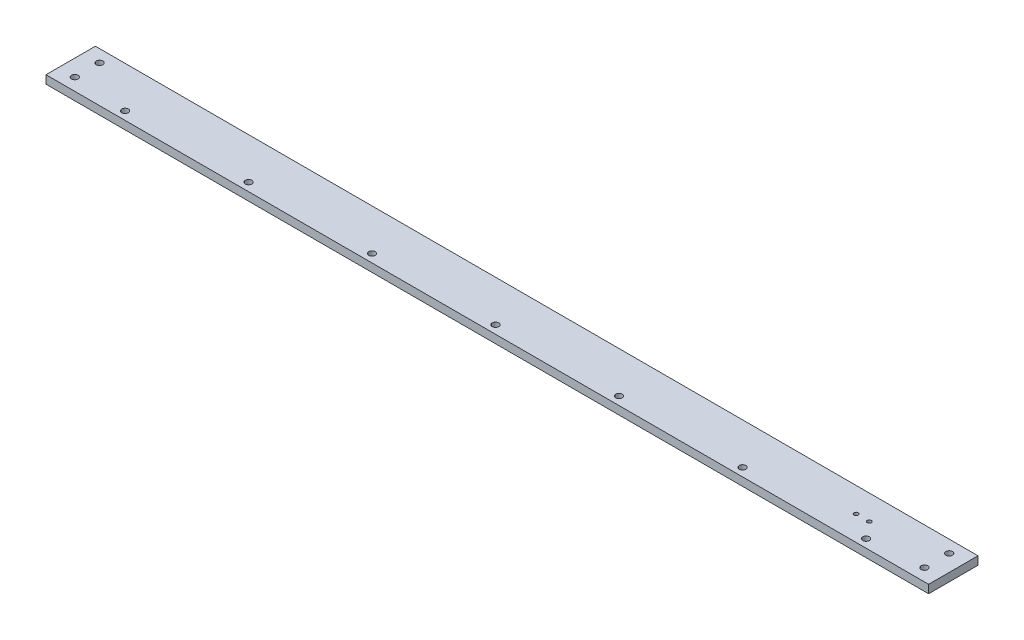
ISO-10303-21;
HEADER;
FILE_DESCRIPTION(('STEP AP214'),'2;1');
FILE_NAME('part.step','',(''),(''),'','','');
FILE_SCHEMA(('AUTOMOTIVE_DESIGN { 1 0 10303 214 1 1 1 1 }'));
ENDSEC;
DATA;
#1=APPLICATION_CONTEXT('core data for automotive mechanical design processes');
#2=APPLICATION_PROTOCOL_DEFINITION('international standard','automotive_design',2000,#1);
#3=PRODUCT_CONTEXT('',#1,'mechanical');
#4=PRODUCT('Part','Part','',(#3));
#5=PRODUCT_RELATED_PRODUCT_CATEGORY('part','',(#4));
#6=PRODUCT_DEFINITION_FORMATION('','',#4);
#7=PRODUCT_DEFINITION_CONTEXT('part definition',#1,'design');
#8=PRODUCT_DEFINITION('design','',#6,#7);
#9=PRODUCT_DEFINITION_SHAPE('','',#8);
#10=(LENGTH_UNIT() NAMED_UNIT(*) SI_UNIT(.MILLI.,.METRE.));
#11=(NAMED_UNIT(*) PLANE_ANGLE_UNIT() SI_UNIT($,.RADIAN.));
#12=(NAMED_UNIT(*) SI_UNIT($,.STERADIAN.) SOLID_ANGLE_UNIT());
#13=UNCERTAINTY_MEASURE_WITH_UNIT(LENGTH_MEASURE(1.E-05),#10,'distance_accuracy_value','');
#14=(GEOMETRIC_REPRESENTATION_CONTEXT(3) GLOBAL_UNCERTAINTY_ASSIGNED_CONTEXT((#13)) GLOBAL_UNIT_ASSIGNED_CONTEXT((#10,
#11,#12)) REPRESENTATION_CONTEXT('',''));
#15=CARTESIAN_POINT('',(0.,0.,0.));
#16=DIRECTION('',(0.,0.,1.));
#17=DIRECTION('',(1.,0.,0.));
#18=AXIS2_PLACEMENT_3D('',#15,#16,#17);
#19=CARTESIAN_POINT('',(-268.,5.,15.));
#20=DIRECTION('',(1.,0.,0.));
#21=DIRECTION('',(0.,0.,-1.));
#22=AXIS2_PLACEMENT_3D('',#19,#20,#21);
#23=PLANE('',#22);
#24=DIRECTION('',(0.,0.,1.));
#25=VECTOR('',#24,1.);
#26=CARTESIAN_POINT('',(-268.,0.,15.));
#27=LINE('',#26,#25);
#28=CARTESIAN_POINT('',(-268.,0.,-15.));
#29=VERTEX_POINT('',#28);
#30=CARTESIAN_POINT('',(-268.,0.,15.));
#31=VERTEX_POINT('',#30);
#32=EDGE_CURVE('E99',#29,#31,#27,.T.);
#33=ORIENTED_EDGE('',*,*,#32,.T.);
#34=DIRECTION('',(0.,-1.,0.));
#35=VECTOR('',#34,1.);
#36=CARTESIAN_POINT('',(-268.,5.,15.));
#37=LINE('',#36,#35);
#38=CARTESIAN_POINT('',(-268.,5.,15.));
#39=VERTEX_POINT('',#38);
#40=EDGE_CURVE('E11',#39,#31,#37,.T.);
#41=ORIENTED_EDGE('',*,*,#40,.F.);
#42=DIRECTION('',(0.,0.,1.));
#43=VECTOR('',#42,1.);
#44=CARTESIAN_POINT('',(-268.,5.,15.));
#45=LINE('',#44,#43);
#46=CARTESIAN_POINT('',(-268.,5.,-15.));
#47=VERTEX_POINT('',#46);
#48=EDGE_CURVE('E86',#47,#39,#45,.T.);
#49=ORIENTED_EDGE('',*,*,#48,.F.);
#50=DIRECTION('',(0.,-1.,0.));
#51=VECTOR('',#50,1.);
#52=CARTESIAN_POINT('',(-268.,5.,-15.));
#53=LINE('',#52,#51);
#54=EDGE_CURVE('E95',#47,#29,#53,.T.);
#55=ORIENTED_EDGE('',*,*,#54,.T.);
#56=EDGE_LOOP('',(#33,#41,#49,#55));
#57=FACE_BOUND('',#56,.T.);
#58=ADVANCED_FACE('F33',(#57),#23,.F.);
#59=CARTESIAN_POINT('',(268.,5.,15.));
#60=DIRECTION('',(0.,0.,-1.));
#61=DIRECTION('',(-1.,0.,0.));
#62=AXIS2_PLACEMENT_3D('',#59,#60,#61);
#63=PLANE('',#62);
#64=DIRECTION('',(1.,0.,0.));
#65=VECTOR('',#64,1.);
#66=CARTESIAN_POINT('',(268.,0.,15.));
#67=LINE('',#66,#65);
#68=CARTESIAN_POINT('',(268.,0.,15.));
#69=VERTEX_POINT('',#68);
#70=EDGE_CURVE('E90',#31,#69,#67,.T.);
#71=ORIENTED_EDGE('',*,*,#70,.T.);
#72=DIRECTION('',(0.,-1.,0.));
#73=VECTOR('',#72,1.);
#74=CARTESIAN_POINT('',(268.,5.,15.));
#75=LINE('',#74,#73);
#76=CARTESIAN_POINT('',(268.,5.,15.));
#77=VERTEX_POINT('',#76);
#78=EDGE_CURVE('E42',#77,#69,#75,.T.);
#79=ORIENTED_EDGE('',*,*,#78,.F.);
#80=DIRECTION('',(1.,0.,0.));
#81=VECTOR('',#80,1.);
#82=CARTESIAN_POINT('',(268.,5.,15.));
#83=LINE('',#82,#81);
#84=EDGE_CURVE('E81',#39,#77,#83,.T.);
#85=ORIENTED_EDGE('',*,*,#84,.F.);
#86=ORIENTED_EDGE('',*,*,#40,.T.);
#87=EDGE_LOOP('',(#71,#79,#85,#86));
#88=FACE_BOUND('',#87,.T.);
#89=ADVANCED_FACE('F89',(#88),#63,.F.);
#90=CARTESIAN_POINT('',(268.,5.,15.));
#91=DIRECTION('',(-1.,0.,0.));
#92=DIRECTION('',(0.,0.,1.));
#93=AXIS2_PLACEMENT_3D('',#90,#91,#92);
#94=PLANE('',#93);
#95=DIRECTION('',(0.,0.,-1.));
#96=VECTOR('',#95,1.);
#97=CARTESIAN_POINT('',(268.,0.,15.));
#98=LINE('',#97,#96);
#99=CARTESIAN_POINT('',(268.,0.,-15.));
#100=VERTEX_POINT('',#99);
#101=EDGE_CURVE('E68',#69,#100,#98,.T.);
#102=ORIENTED_EDGE('',*,*,#101,.T.);
#103=DIRECTION('',(0.,-1.,0.));
#104=VECTOR('',#103,1.);
#105=CARTESIAN_POINT('',(268.,5.,-15.));
#106=LINE('',#105,#104);
#107=CARTESIAN_POINT('',(268.,5.,-15.));
#108=VERTEX_POINT('',#107);
#109=EDGE_CURVE('E91',#108,#100,#106,.T.);
#110=ORIENTED_EDGE('',*,*,#109,.F.);
#111=DIRECTION('',(0.,0.,-1.));
#112=VECTOR('',#111,1.);
#113=CARTESIAN_POINT('',(268.,5.,15.));
#114=LINE('',#113,#112);
#115=EDGE_CURVE('E84',#77,#108,#114,.T.);
#116=ORIENTED_EDGE('',*,*,#115,.F.);
#117=ORIENTED_EDGE('',*,*,#78,.T.);
#118=EDGE_LOOP('',(#102,#110,#116,#117));
#119=FACE_BOUND('',#118,.T.);
#120=ADVANCED_FACE('F93',(#119),#94,.F.);
#121=CARTESIAN_POINT('',(268.,5.,-15.));
#122=DIRECTION('',(0.,0.,1.));
#123=DIRECTION('',(1.,0.,0.));
#124=AXIS2_PLACEMENT_3D('',#121,#122,#123);
#125=PLANE('',#124);
#126=DIRECTION('',(-1.,0.,0.));
#127=VECTOR('',#126,1.);
#128=CARTESIAN_POINT('',(268.,0.,-15.));
#129=LINE('',#128,#127);
#130=EDGE_CURVE('E74',#100,#29,#129,.T.);
#131=ORIENTED_EDGE('',*,*,#130,.T.);
#132=ORIENTED_EDGE('',*,*,#54,.F.);
#133=DIRECTION('',(-1.,0.,0.));
#134=VECTOR('',#133,1.);
#135=CARTESIAN_POINT('',(268.,5.,-15.));
#136=LINE('',#135,#134);
#137=EDGE_CURVE('E51',#108,#47,#136,.T.);
#138=ORIENTED_EDGE('',*,*,#137,.F.);
#139=ORIENTED_EDGE('',*,*,#109,.T.);
#140=EDGE_LOOP('',(#131,#132,#138,#139));
#141=FACE_BOUND('',#140,.T.);
#142=ADVANCED_FACE('F197',(#141),#125,.F.);
#143=CARTESIAN_POINT('',(0.,5.,0.));
#144=DIRECTION('',(0.,1.,0.));
#145=DIRECTION('',(0.,0.,1.));
#146=AXIS2_PLACEMENT_3D('',#143,#144,#145);
#147=PLANE('',#146);
#148=CARTESIAN_POINT('',(216.980485857023,5.,0.));
#149=DIRECTION('',(0.,1.,0.));
#150=DIRECTION('',(0.,0.,1.));
#151=AXIS2_PLACEMENT_3D('',#148,#149,#150);
#152=CIRCLE('',#151,1.25);
#153=CARTESIAN_POINT('',(216.980485857023,5.,1.24999999999998));
#154=VERTEX_POINT('',#153);
#155=EDGE_CURVE('E36',#154,#154,#152,.T.);
#156=ORIENTED_EDGE('',*,*,#155,.F.);
#157=EDGE_LOOP('',(#156));
#158=FACE_BOUND('',#157,.T.);
#159=CARTESIAN_POINT('',(208.980485857023,5.,0.));
#160=DIRECTION('',(0.,1.,0.));
#161=DIRECTION('',(0.,0.,1.));
#162=AXIS2_PLACEMENT_3D('',#159,#160,#161);
#163=CIRCLE('',#162,1.25);
#164=CARTESIAN_POINT('',(208.980485857023,5.,1.24999999999998));
#165=VERTEX_POINT('',#164);
#166=EDGE_CURVE('E107',#165,#165,#163,.T.);
#167=ORIENTED_EDGE('',*,*,#166,.F.);
#168=EDGE_LOOP('',(#167));
#169=FACE_BOUND('',#168,.T.);
#170=CARTESIAN_POINT('',(-258.,5.,-7.49999999999996));
#171=DIRECTION('',(0.,1.,0.));
#172=DIRECTION('',(0.,0.,1.));
#173=AXIS2_PLACEMENT_3D('',#170,#171,#172);
#174=CIRCLE('',#173,2.);
#175=CARTESIAN_POINT('',(-258.,5.,-5.49999999999996));
#176=VERTEX_POINT('',#175);
#177=EDGE_CURVE('E109',#176,#176,#174,.T.);
#178=ORIENTED_EDGE('',*,*,#177,.F.);
#179=EDGE_LOOP('',(#178));
#180=FACE_BOUND('',#179,.T.);
#181=CARTESIAN_POINT('',(-258.,5.,7.50000000000004));
#182=DIRECTION('',(0.,1.,0.));
#183=DIRECTION('',(0.,0.,1.));
#184=AXIS2_PLACEMENT_3D('',#181,#182,#183);
#185=CIRCLE('',#184,2.);
#186=CARTESIAN_POINT('',(-258.,5.,9.50000000000004));
#187=VERTEX_POINT('',#186);
#188=EDGE_CURVE('E126',#187,#187,#185,.T.);
#189=ORIENTED_EDGE('',*,*,#188,.F.);
#190=EDGE_LOOP('',(#189));
#191=FACE_BOUND('',#190,.T.);
#192=CARTESIAN_POINT('',(-225.,5.,10.0000000000001));
#193=DIRECTION('',(0.,1.,0.));
#194=DIRECTION('',(0.,0.,1.));
#195=AXIS2_PLACEMENT_3D('',#192,#193,#194);
#196=CIRCLE('',#195,2.);
#197=CARTESIAN_POINT('',(-225.,5.,12.0000000000001));
#198=VERTEX_POINT('',#197);
#199=EDGE_CURVE('E132',#198,#198,#196,.T.);
#200=ORIENTED_EDGE('',*,*,#199,.F.);
#201=EDGE_LOOP('',(#200));
#202=FACE_BOUND('',#201,.T.);
#203=CARTESIAN_POINT('',(-150.,5.,10.0000000000001));
#204=DIRECTION('',(0.,1.,0.));
#205=DIRECTION('',(0.,0.,1.));
#206=AXIS2_PLACEMENT_3D('',#203,#204,#205);
#207=CIRCLE('',#206,2.);
#208=CARTESIAN_POINT('',(-150.,5.,12.0000000000001));
#209=VERTEX_POINT('',#208);
#210=EDGE_CURVE('E138',#209,#209,#207,.T.);
#211=ORIENTED_EDGE('',*,*,#210,.F.);
#212=EDGE_LOOP('',(#211));
#213=FACE_BOUND('',#212,.T.);
#214=CARTESIAN_POINT('',(-75.,5.,10.0000000000001));
#215=DIRECTION('',(0.,1.,0.));
#216=DIRECTION('',(0.,0.,1.));
#217=AXIS2_PLACEMENT_3D('',#214,#215,#216);
#218=CIRCLE('',#217,2.);
#219=CARTESIAN_POINT('',(-75.,5.,12.0000000000001));
#220=VERTEX_POINT('',#219);
#221=EDGE_CURVE('E144',#220,#220,#218,.T.);
#222=ORIENTED_EDGE('',*,*,#221,.F.);
#223=EDGE_LOOP('',(#222));
#224=FACE_BOUND('',#223,.T.);
#225=CARTESIAN_POINT('',(0.,5.,10.));
#226=DIRECTION('',(0.,1.,0.));
#227=DIRECTION('',(0.,0.,1.));
#228=AXIS2_PLACEMENT_3D('',#225,#226,#227);
#229=CIRCLE('',#228,2.);
#230=CARTESIAN_POINT('',(0.,5.,12.));
#231=VERTEX_POINT('',#230);
#232=EDGE_CURVE('E150',#231,#231,#229,.T.);
#233=ORIENTED_EDGE('',*,*,#232,.F.);
#234=EDGE_LOOP('',(#233));
#235=FACE_BOUND('',#234,.T.);
#236=CARTESIAN_POINT('',(75.,5.,10.));
#237=DIRECTION('',(0.,1.,0.));
#238=DIRECTION('',(0.,0.,1.));
#239=AXIS2_PLACEMENT_3D('',#236,#237,#238);
#240=CIRCLE('',#239,2.);
#241=CARTESIAN_POINT('',(75.,5.,12.));
#242=VERTEX_POINT('',#241);
#243=EDGE_CURVE('E156',#242,#242,#240,.T.);
#244=ORIENTED_EDGE('',*,*,#243,.F.);
#245=EDGE_LOOP('',(#244));
#246=FACE_BOUND('',#245,.T.);
#247=CARTESIAN_POINT('',(150.,5.,10.));
#248=DIRECTION('',(0.,1.,0.));
#249=DIRECTION('',(0.,0.,1.));
#250=AXIS2_PLACEMENT_3D('',#247,#248,#249);
#251=CIRCLE('',#250,2.);
#252=CARTESIAN_POINT('',(150.,5.,12.));
#253=VERTEX_POINT('',#252);
#254=EDGE_CURVE('E162',#253,#253,#251,.T.);
#255=ORIENTED_EDGE('',*,*,#254,.F.);
#256=EDGE_LOOP('',(#255));
#257=FACE_BOUND('',#256,.T.);
#258=CARTESIAN_POINT('',(225.,5.,10.));
#259=DIRECTION('',(0.,1.,0.));
#260=DIRECTION('',(0.,0.,1.));
#261=AXIS2_PLACEMENT_3D('',#258,#259,#260);
#262=CIRCLE('',#261,2.);
#263=CARTESIAN_POINT('',(225.,5.,12.));
#264=VERTEX_POINT('',#263);
#265=EDGE_CURVE('E168',#264,#264,#262,.T.);
#266=ORIENTED_EDGE('',*,*,#265,.F.);
#267=EDGE_LOOP('',(#266));
#268=FACE_BOUND('',#267,.T.);
#269=CARTESIAN_POINT('',(258.,5.,7.50000000000004));
#270=DIRECTION('',(0.,1.,0.));
#271=DIRECTION('',(0.,0.,1.));
#272=AXIS2_PLACEMENT_3D('',#269,#270,#271);
#273=CIRCLE('',#272,2.);
#274=CARTESIAN_POINT('',(258.,5.,9.50000000000004));
#275=VERTEX_POINT('',#274);
#276=EDGE_CURVE('E174',#275,#275,#273,.T.);
#277=ORIENTED_EDGE('',*,*,#276,.F.);
#278=EDGE_LOOP('',(#277));
#279=FACE_BOUND('',#278,.T.);
#280=CARTESIAN_POINT('',(258.,5.,-7.49999999999996));
#281=DIRECTION('',(0.,1.,0.));
#282=DIRECTION('',(0.,0.,1.));
#283=AXIS2_PLACEMENT_3D('',#280,#281,#282);
#284=CIRCLE('',#283,2.);
#285=CARTESIAN_POINT('',(258.,5.,-5.49999999999996));
#286=VERTEX_POINT('',#285);
#287=EDGE_CURVE('E180',#286,#286,#284,.T.);
#288=ORIENTED_EDGE('',*,*,#287,.F.);
#289=EDGE_LOOP('',(#288));
#290=FACE_BOUND('',#289,.T.);
#291=ORIENTED_EDGE('',*,*,#48,.T.);
#292=ORIENTED_EDGE('',*,*,#84,.T.);
#293=ORIENTED_EDGE('',*,*,#115,.T.);
#294=ORIENTED_EDGE('',*,*,#137,.T.);
#295=EDGE_LOOP('',(#291,#292,#293,#294));
#296=FACE_BOUND('',#295,.T.);
#297=ADVANCED_FACE('F82',(#158,#169,#180,#191,#202,#213,#224,#235,#246,#257,#268,#279,#290,
#296),#147,.T.);
#298=CARTESIAN_POINT('',(0.,0.,0.));
#299=DIRECTION('',(0.,1.,0.));
#300=DIRECTION('',(0.,0.,1.));
#301=AXIS2_PLACEMENT_3D('',#298,#299,#300);
#302=PLANE('',#301);
#303=CARTESIAN_POINT('',(216.980485857023,0.,0.));
#304=DIRECTION('',(0.,-1.,0.));
#305=DIRECTION('',(0.,0.,-1.));
#306=AXIS2_PLACEMENT_3D('',#303,#304,#305);
#307=CIRCLE('',#306,1.25);
#308=CARTESIAN_POINT('',(216.980485857023,0.,-1.25000000000003));
#309=VERTEX_POINT('',#308);
#310=EDGE_CURVE('E121',#309,#309,#307,.T.);
#311=ORIENTED_EDGE('',*,*,#310,.F.);
#312=EDGE_LOOP('',(#311));
#313=FACE_BOUND('',#312,.T.);
#314=CARTESIAN_POINT('',(208.980485857023,0.,0.));
#315=DIRECTION('',(0.,-1.,0.));
#316=DIRECTION('',(0.,0.,-1.));
#317=AXIS2_PLACEMENT_3D('',#314,#315,#316);
#318=CIRCLE('',#317,1.25);
#319=CARTESIAN_POINT('',(208.980485857023,0.,-1.25000000000003));
#320=VERTEX_POINT('',#319);
#321=EDGE_CURVE('E110',#320,#320,#318,.T.);
#322=ORIENTED_EDGE('',*,*,#321,.F.);
#323=EDGE_LOOP('',(#322));
#324=FACE_BOUND('',#323,.T.);
#325=CARTESIAN_POINT('',(-258.,0.,-7.49999999999996));
#326=DIRECTION('',(0.,1.,0.));
#327=DIRECTION('',(0.,0.,1.));
#328=AXIS2_PLACEMENT_3D('',#325,#326,#327);
#329=CIRCLE('',#328,2.);
#330=CARTESIAN_POINT('',(-258.,0.,-5.49999999999996));
#331=VERTEX_POINT('',#330);
#332=EDGE_CURVE('E114',#331,#331,#329,.T.);
#333=ORIENTED_EDGE('',*,*,#332,.T.);
#334=EDGE_LOOP('',(#333));
#335=FACE_BOUND('',#334,.T.);
#336=CARTESIAN_POINT('',(-258.,0.,7.50000000000004));
#337=DIRECTION('',(0.,1.,0.));
#338=DIRECTION('',(0.,0.,1.));
#339=AXIS2_PLACEMENT_3D('',#336,#337,#338);
#340=CIRCLE('',#339,2.);
#341=CARTESIAN_POINT('',(-258.,0.,9.50000000000004));
#342=VERTEX_POINT('',#341);
#343=EDGE_CURVE('E129',#342,#342,#340,.T.);
#344=ORIENTED_EDGE('',*,*,#343,.T.);
#345=EDGE_LOOP('',(#344));
#346=FACE_BOUND('',#345,.T.);
#347=CARTESIAN_POINT('',(-225.,0.,10.0000000000001));
#348=DIRECTION('',(0.,1.,0.));
#349=DIRECTION('',(0.,0.,1.));
#350=AXIS2_PLACEMENT_3D('',#347,#348,#349);
#351=CIRCLE('',#350,2.);
#352=CARTESIAN_POINT('',(-225.,0.,12.0000000000001));
#353=VERTEX_POINT('',#352);
#354=EDGE_CURVE('E135',#353,#353,#351,.T.);
#355=ORIENTED_EDGE('',*,*,#354,.T.);
#356=EDGE_LOOP('',(#355));
#357=FACE_BOUND('',#356,.T.);
#358=CARTESIAN_POINT('',(-150.,0.,10.0000000000001));
#359=DIRECTION('',(0.,1.,0.));
#360=DIRECTION('',(0.,0.,1.));
#361=AXIS2_PLACEMENT_3D('',#358,#359,#360);
#362=CIRCLE('',#361,2.);
#363=CARTESIAN_POINT('',(-150.,0.,12.0000000000001));
#364=VERTEX_POINT('',#363);
#365=EDGE_CURVE('E141',#364,#364,#362,.T.);
#366=ORIENTED_EDGE('',*,*,#365,.T.);
#367=EDGE_LOOP('',(#366));
#368=FACE_BOUND('',#367,.T.);
#369=CARTESIAN_POINT('',(-75.,0.,10.0000000000001));
#370=DIRECTION('',(0.,1.,0.));
#371=DIRECTION('',(0.,0.,1.));
#372=AXIS2_PLACEMENT_3D('',#369,#370,#371);
#373=CIRCLE('',#372,2.);
#374=CARTESIAN_POINT('',(-75.,0.,12.0000000000001));
#375=VERTEX_POINT('',#374);
#376=EDGE_CURVE('E147',#375,#375,#373,.T.);
#377=ORIENTED_EDGE('',*,*,#376,.T.);
#378=EDGE_LOOP('',(#377));
#379=FACE_BOUND('',#378,.T.);
#380=CARTESIAN_POINT('',(0.,0.,10.));
#381=DIRECTION('',(0.,1.,0.));
#382=DIRECTION('',(0.,0.,1.));
#383=AXIS2_PLACEMENT_3D('',#380,#381,#382);
#384=CIRCLE('',#383,2.);
#385=CARTESIAN_POINT('',(0.,0.,12.));
#386=VERTEX_POINT('',#385);
#387=EDGE_CURVE('E153',#386,#386,#384,.T.);
#388=ORIENTED_EDGE('',*,*,#387,.T.);
#389=EDGE_LOOP('',(#388));
#390=FACE_BOUND('',#389,.T.);
#391=CARTESIAN_POINT('',(75.,0.,10.));
#392=DIRECTION('',(0.,1.,0.));
#393=DIRECTION('',(0.,0.,1.));
#394=AXIS2_PLACEMENT_3D('',#391,#392,#393);
#395=CIRCLE('',#394,2.);
#396=CARTESIAN_POINT('',(75.,0.,12.));
#397=VERTEX_POINT('',#396);
#398=EDGE_CURVE('E159',#397,#397,#395,.T.);
#399=ORIENTED_EDGE('',*,*,#398,.T.);
#400=EDGE_LOOP('',(#399));
#401=FACE_BOUND('',#400,.T.);
#402=CARTESIAN_POINT('',(150.,0.,10.));
#403=DIRECTION('',(0.,1.,0.));
#404=DIRECTION('',(0.,0.,1.));
#405=AXIS2_PLACEMENT_3D('',#402,#403,#404);
#406=CIRCLE('',#405,2.);
#407=CARTESIAN_POINT('',(150.,0.,12.));
#408=VERTEX_POINT('',#407);
#409=EDGE_CURVE('E165',#408,#408,#406,.T.);
#410=ORIENTED_EDGE('',*,*,#409,.T.);
#411=EDGE_LOOP('',(#410));
#412=FACE_BOUND('',#411,.T.);
#413=CARTESIAN_POINT('',(225.,0.,10.));
#414=DIRECTION('',(0.,1.,0.));
#415=DIRECTION('',(0.,0.,1.));
#416=AXIS2_PLACEMENT_3D('',#413,#414,#415);
#417=CIRCLE('',#416,2.);
#418=CARTESIAN_POINT('',(225.,0.,12.));
#419=VERTEX_POINT('',#418);
#420=EDGE_CURVE('E171',#419,#419,#417,.T.);
#421=ORIENTED_EDGE('',*,*,#420,.T.);
#422=EDGE_LOOP('',(#421));
#423=FACE_BOUND('',#422,.T.);
#424=CARTESIAN_POINT('',(258.,0.,7.50000000000004));
#425=DIRECTION('',(0.,1.,0.));
#426=DIRECTION('',(0.,0.,1.));
#427=AXIS2_PLACEMENT_3D('',#424,#425,#426);
#428=CIRCLE('',#427,2.);
#429=CARTESIAN_POINT('',(258.,0.,9.50000000000004));
#430=VERTEX_POINT('',#429);
#431=EDGE_CURVE('E177',#430,#430,#428,.T.);
#432=ORIENTED_EDGE('',*,*,#431,.T.);
#433=EDGE_LOOP('',(#432));
#434=FACE_BOUND('',#433,.T.);
#435=CARTESIAN_POINT('',(258.,0.,-7.49999999999996));
#436=DIRECTION('',(0.,1.,0.));
#437=DIRECTION('',(0.,0.,1.));
#438=AXIS2_PLACEMENT_3D('',#435,#436,#437);
#439=CIRCLE('',#438,2.);
#440=CARTESIAN_POINT('',(258.,0.,-5.49999999999996));
#441=VERTEX_POINT('',#440);
#442=EDGE_CURVE('E102',#441,#441,#439,.T.);
#443=ORIENTED_EDGE('',*,*,#442,.T.);
#444=EDGE_LOOP('',(#443));
#445=FACE_BOUND('',#444,.T.);
#446=ORIENTED_EDGE('',*,*,#32,.F.);
#447=ORIENTED_EDGE('',*,*,#130,.F.);
#448=ORIENTED_EDGE('',*,*,#101,.F.);
#449=ORIENTED_EDGE('',*,*,#70,.F.);
#450=EDGE_LOOP('',(#446,#447,#448,#449));
#451=FACE_BOUND('',#450,.T.);
#452=ADVANCED_FACE('F186',(#313,#324,#335,#346,#357,#368,#379,#390,#401,#412,#423,#434,#445,
#451),#302,.F.);
#453=CARTESIAN_POINT('',(258.,5.,-7.49999999999996));
#454=DIRECTION('',(0.,1.,0.));
#455=DIRECTION('',(0.,0.,1.));
#456=AXIS2_PLACEMENT_3D('',#453,#454,#455);
#457=CYLINDRICAL_SURFACE('',#456,2.);
#458=ORIENTED_EDGE('',*,*,#442,.F.);
#459=EDGE_LOOP('',(#458));
#460=FACE_BOUND('',#459,.T.);
#461=ORIENTED_EDGE('',*,*,#287,.T.);
#462=EDGE_LOOP('',(#461));
#463=FACE_BOUND('',#462,.T.);
#464=ADVANCED_FACE('F189',(#460,#463),#457,.F.);
#465=CARTESIAN_POINT('',(258.,5.,7.50000000000004));
#466=DIRECTION('',(0.,1.,0.));
#467=DIRECTION('',(0.,0.,1.));
#468=AXIS2_PLACEMENT_3D('',#465,#466,#467);
#469=CYLINDRICAL_SURFACE('',#468,2.);
#470=ORIENTED_EDGE('',*,*,#431,.F.);
#471=EDGE_LOOP('',(#470));
#472=FACE_BOUND('',#471,.T.);
#473=ORIENTED_EDGE('',*,*,#276,.T.);
#474=EDGE_LOOP('',(#473));
#475=FACE_BOUND('',#474,.T.);
#476=ADVANCED_FACE('F192',(#472,#475),#469,.F.);
#477=CARTESIAN_POINT('',(225.,5.,10.));
#478=DIRECTION('',(0.,1.,0.));
#479=DIRECTION('',(0.,0.,1.));
#480=AXIS2_PLACEMENT_3D('',#477,#478,#479);
#481=CYLINDRICAL_SURFACE('',#480,2.);
#482=ORIENTED_EDGE('',*,*,#420,.F.);
#483=EDGE_LOOP('',(#482));
#484=FACE_BOUND('',#483,.T.);
#485=ORIENTED_EDGE('',*,*,#265,.T.);
#486=EDGE_LOOP('',(#485));
#487=FACE_BOUND('',#486,.T.);
#488=ADVANCED_FACE('F247',(#484,#487),#481,.F.);
#489=CARTESIAN_POINT('',(150.,5.,10.));
#490=DIRECTION('',(0.,1.,0.));
#491=DIRECTION('',(0.,0.,1.));
#492=AXIS2_PLACEMENT_3D('',#489,#490,#491);
#493=CYLINDRICAL_SURFACE('',#492,2.);
#494=ORIENTED_EDGE('',*,*,#409,.F.);
#495=EDGE_LOOP('',(#494));
#496=FACE_BOUND('',#495,.T.);
#497=ORIENTED_EDGE('',*,*,#254,.T.);
#498=EDGE_LOOP('',(#497));
#499=FACE_BOUND('',#498,.T.);
#500=ADVANCED_FACE('F255',(#496,#499),#493,.F.);
#501=CARTESIAN_POINT('',(75.,5.,10.));
#502=DIRECTION('',(0.,1.,0.));
#503=DIRECTION('',(0.,0.,1.));
#504=AXIS2_PLACEMENT_3D('',#501,#502,#503);
#505=CYLINDRICAL_SURFACE('',#504,2.);
#506=ORIENTED_EDGE('',*,*,#398,.F.);
#507=EDGE_LOOP('',(#506));
#508=FACE_BOUND('',#507,.T.);
#509=ORIENTED_EDGE('',*,*,#243,.T.);
#510=EDGE_LOOP('',(#509));
#511=FACE_BOUND('',#510,.T.);
#512=ADVANCED_FACE('F263',(#508,#511),#505,.F.);
#513=CARTESIAN_POINT('',(0.,5.,10.));
#514=DIRECTION('',(0.,1.,0.));
#515=DIRECTION('',(0.,0.,1.));
#516=AXIS2_PLACEMENT_3D('',#513,#514,#515);
#517=CYLINDRICAL_SURFACE('',#516,2.);
#518=ORIENTED_EDGE('',*,*,#387,.F.);
#519=EDGE_LOOP('',(#518));
#520=FACE_BOUND('',#519,.T.);
#521=ORIENTED_EDGE('',*,*,#232,.T.);
#522=EDGE_LOOP('',(#521));
#523=FACE_BOUND('',#522,.T.);
#524=ADVANCED_FACE('F271',(#520,#523),#517,.F.);
#525=CARTESIAN_POINT('',(-75.,5.,10.0000000000001));
#526=DIRECTION('',(0.,1.,0.));
#527=DIRECTION('',(0.,0.,1.));
#528=AXIS2_PLACEMENT_3D('',#525,#526,#527);
#529=CYLINDRICAL_SURFACE('',#528,2.);
#530=ORIENTED_EDGE('',*,*,#376,.F.);
#531=EDGE_LOOP('',(#530));
#532=FACE_BOUND('',#531,.T.);
#533=ORIENTED_EDGE('',*,*,#221,.T.);
#534=EDGE_LOOP('',(#533));
#535=FACE_BOUND('',#534,.T.);
#536=ADVANCED_FACE('F279',(#532,#535),#529,.F.);
#537=CARTESIAN_POINT('',(-150.,5.,10.0000000000001));
#538=DIRECTION('',(0.,1.,0.));
#539=DIRECTION('',(0.,0.,1.));
#540=AXIS2_PLACEMENT_3D('',#537,#538,#539);
#541=CYLINDRICAL_SURFACE('',#540,2.);
#542=ORIENTED_EDGE('',*,*,#365,.F.);
#543=EDGE_LOOP('',(#542));
#544=FACE_BOUND('',#543,.T.);
#545=ORIENTED_EDGE('',*,*,#210,.T.);
#546=EDGE_LOOP('',(#545));
#547=FACE_BOUND('',#546,.T.);
#548=ADVANCED_FACE('F287',(#544,#547),#541,.F.);
#549=CARTESIAN_POINT('',(-225.,5.,10.0000000000001));
#550=DIRECTION('',(0.,1.,0.));
#551=DIRECTION('',(0.,0.,1.));
#552=AXIS2_PLACEMENT_3D('',#549,#550,#551);
#553=CYLINDRICAL_SURFACE('',#552,2.);
#554=ORIENTED_EDGE('',*,*,#354,.F.);
#555=EDGE_LOOP('',(#554));
#556=FACE_BOUND('',#555,.T.);
#557=ORIENTED_EDGE('',*,*,#199,.T.);
#558=EDGE_LOOP('',(#557));
#559=FACE_BOUND('',#558,.T.);
#560=ADVANCED_FACE('F295',(#556,#559),#553,.F.);
#561=CARTESIAN_POINT('',(-258.,5.,7.50000000000004));
#562=DIRECTION('',(0.,1.,0.));
#563=DIRECTION('',(0.,0.,1.));
#564=AXIS2_PLACEMENT_3D('',#561,#562,#563);
#565=CYLINDRICAL_SURFACE('',#564,2.);
#566=ORIENTED_EDGE('',*,*,#343,.F.);
#567=EDGE_LOOP('',(#566));
#568=FACE_BOUND('',#567,.T.);
#569=ORIENTED_EDGE('',*,*,#188,.T.);
#570=EDGE_LOOP('',(#569));
#571=FACE_BOUND('',#570,.T.);
#572=ADVANCED_FACE('F303',(#568,#571),#565,.F.);
#573=CARTESIAN_POINT('',(-258.,5.,-7.49999999999996));
#574=DIRECTION('',(0.,1.,0.));
#575=DIRECTION('',(0.,0.,1.));
#576=AXIS2_PLACEMENT_3D('',#573,#574,#575);
#577=CYLINDRICAL_SURFACE('',#576,2.);
#578=ORIENTED_EDGE('',*,*,#332,.F.);
#579=EDGE_LOOP('',(#578));
#580=FACE_BOUND('',#579,.T.);
#581=ORIENTED_EDGE('',*,*,#177,.T.);
#582=EDGE_LOOP('',(#581));
#583=FACE_BOUND('',#582,.T.);
#584=ADVANCED_FACE('F311',(#580,#583),#577,.F.);
#585=CARTESIAN_POINT('',(208.980485857023,0.,0.));
#586=DIRECTION('',(0.,-1.,0.));
#587=DIRECTION('',(0.,0.,-1.));
#588=AXIS2_PLACEMENT_3D('',#585,#586,#587);
#589=CYLINDRICAL_SURFACE('',#588,1.25);
#590=ORIENTED_EDGE('',*,*,#166,.T.);
#591=EDGE_LOOP('',(#590));
#592=FACE_BOUND('',#591,.T.);
#593=ORIENTED_EDGE('',*,*,#321,.T.);
#594=EDGE_LOOP('',(#593));
#595=FACE_BOUND('',#594,.T.);
#596=ADVANCED_FACE('F318',(#592,#595),#589,.F.);
#597=CARTESIAN_POINT('',(216.980485857023,0.,0.));
#598=DIRECTION('',(0.,-1.,0.));
#599=DIRECTION('',(0.,0.,-1.));
#600=AXIS2_PLACEMENT_3D('',#597,#598,#599);
#601=CYLINDRICAL_SURFACE('',#600,1.25);
#602=ORIENTED_EDGE('',*,*,#155,.T.);
#603=EDGE_LOOP('',(#602));
#604=FACE_BOUND('',#603,.T.);
#605=ORIENTED_EDGE('',*,*,#310,.T.);
#606=EDGE_LOOP('',(#605));
#607=FACE_BOUND('',#606,.T.);
#608=ADVANCED_FACE('F325',(#604,#607),#601,.F.);
#609=CLOSED_SHELL('',(#58,#89,#120,#142,#297,#452,#464,#476,#488,#500,#512,#524,#536,#548,#560,
#572,#584,#596,#608));
#610=MANIFOLD_SOLID_BREP('B2',#609);
#611=ADVANCED_BREP_SHAPE_REPRESENTATION('',(#18,#610),#14);
#612=SHAPE_DEFINITION_REPRESENTATION(#9,#611);
ENDSEC;
END-ISO-10303-21;
